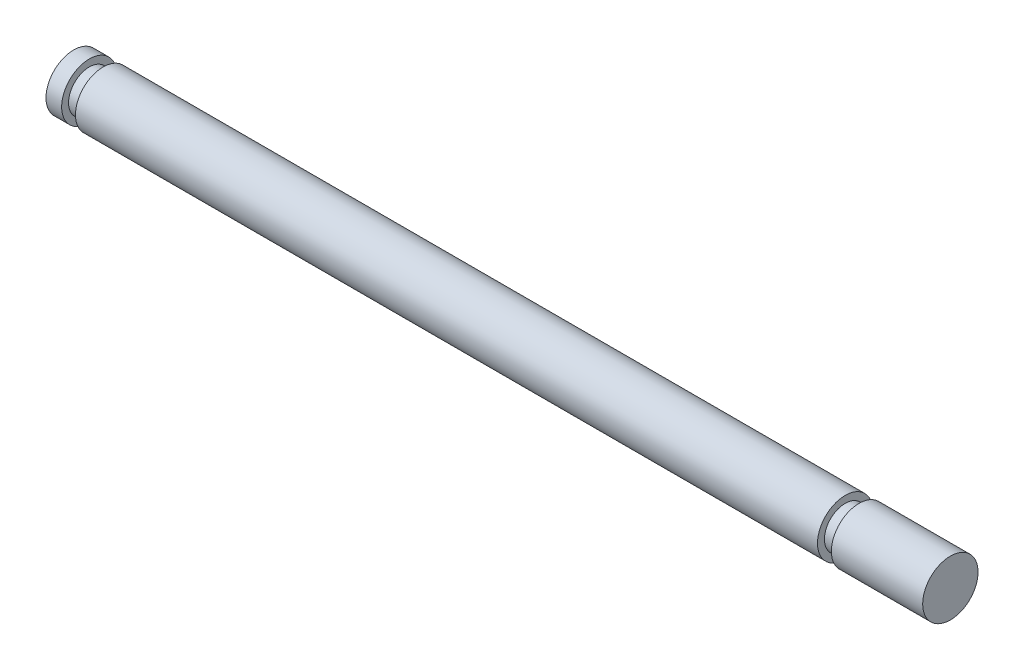
ISO-10303-21;
HEADER;
FILE_DESCRIPTION(('STEP AP214'),'2;1');
FILE_NAME('part.step','',(''),(''),'','','');
FILE_SCHEMA(('AUTOMOTIVE_DESIGN { 1 0 10303 214 1 1 1 1 }'));
ENDSEC;
DATA;
#1=APPLICATION_CONTEXT('core data for automotive mechanical design processes');
#2=APPLICATION_PROTOCOL_DEFINITION('international standard','automotive_design',2000,#1);
#3=PRODUCT_CONTEXT('',#1,'mechanical');
#4=PRODUCT('Part','Part','',(#3));
#5=PRODUCT_RELATED_PRODUCT_CATEGORY('part','',(#4));
#6=PRODUCT_DEFINITION_FORMATION('','',#4);
#7=PRODUCT_DEFINITION_CONTEXT('part definition',#1,'design');
#8=PRODUCT_DEFINITION('design','',#6,#7);
#9=PRODUCT_DEFINITION_SHAPE('','',#8);
#10=(LENGTH_UNIT() NAMED_UNIT(*) SI_UNIT(.MILLI.,.METRE.));
#11=(NAMED_UNIT(*) PLANE_ANGLE_UNIT() SI_UNIT($,.RADIAN.));
#12=(NAMED_UNIT(*) SI_UNIT($,.STERADIAN.) SOLID_ANGLE_UNIT());
#13=UNCERTAINTY_MEASURE_WITH_UNIT(LENGTH_MEASURE(1.E-05),#10,'distance_accuracy_value','');
#14=(GEOMETRIC_REPRESENTATION_CONTEXT(3) GLOBAL_UNCERTAINTY_ASSIGNED_CONTEXT((#13)) GLOBAL_UNIT_ASSIGNED_CONTEXT((#10,
#11,#12)) REPRESENTATION_CONTEXT('',''));
#15=CARTESIAN_POINT('',(0.,0.,0.));
#16=DIRECTION('',(0.,0.,1.));
#17=DIRECTION('',(1.,0.,0.));
#18=AXIS2_PLACEMENT_3D('',#15,#16,#17);
#19=CARTESIAN_POINT('',(1583.,0.,0.));
#20=DIRECTION('',(-1.,0.,0.));
#21=DIRECTION('',(0.,0.,1.));
#22=AXIS2_PLACEMENT_3D('',#19,#20,#21);
#23=PLANE('',#22);
#24=CARTESIAN_POINT('',(1583.,0.,0.));
#25=DIRECTION('',(-1.,0.,0.));
#26=DIRECTION('',(0.,0.,1.));
#27=AXIS2_PLACEMENT_3D('',#24,#25,#26);
#28=CIRCLE('',#27,50.);
#29=CARTESIAN_POINT('',(1583.,0.,50.));
#30=VERTEX_POINT('',#29);
#31=EDGE_CURVE('E10',#30,#30,#28,.T.);
#32=ORIENTED_EDGE('',*,*,#31,.F.);
#33=EDGE_LOOP('',(#32));
#34=FACE_BOUND('',#33,.T.);
#35=ADVANCED_FACE('F31',(#34),#23,.F.);
#36=CARTESIAN_POINT('',(0.,0.,0.));
#37=DIRECTION('',(-1.,0.,0.));
#38=DIRECTION('',(0.,0.,1.));
#39=AXIS2_PLACEMENT_3D('',#36,#37,#38);
#40=CYLINDRICAL_SURFACE('',#39,50.);
#41=CARTESIAN_POINT('',(1418.1,0.,0.));
#42=DIRECTION('',(-1.,0.,0.));
#43=DIRECTION('',(0.,0.,1.));
#44=AXIS2_PLACEMENT_3D('',#41,#42,#43);
#45=CIRCLE('',#44,50.);
#46=CARTESIAN_POINT('',(1418.1,0.,50.));
#47=VERTEX_POINT('',#46);
#48=EDGE_CURVE('E37',#47,#47,#45,.T.);
#49=ORIENTED_EDGE('',*,*,#48,.F.);
#50=EDGE_LOOP('',(#49));
#51=FACE_BOUND('',#50,.T.);
#52=ORIENTED_EDGE('',*,*,#31,.T.);
#53=EDGE_LOOP('',(#52));
#54=FACE_BOUND('',#53,.T.);
#55=ADVANCED_FACE('F115',(#51,#54),#40,.T.);
#56=CARTESIAN_POINT('',(1418.1,50.,0.));
#57=DIRECTION('',(1.,0.,0.));
#58=DIRECTION('',(0.,0.,-1.));
#59=AXIS2_PLACEMENT_3D('',#56,#57,#58);
#60=PLANE('',#59);
#61=CARTESIAN_POINT('',(1418.1,0.,0.));
#62=DIRECTION('',(-1.,0.,0.));
#63=DIRECTION('',(0.,0.,1.));
#64=AXIS2_PLACEMENT_3D('',#61,#62,#63);
#65=CIRCLE('',#64,37.5);
#66=CARTESIAN_POINT('',(1418.1,0.,37.5));
#67=VERTEX_POINT('',#66);
#68=EDGE_CURVE('E41',#67,#67,#65,.T.);
#69=ORIENTED_EDGE('',*,*,#68,.F.);
#70=EDGE_LOOP('',(#69));
#71=FACE_BOUND('',#70,.T.);
#72=ORIENTED_EDGE('',*,*,#48,.T.);
#73=EDGE_LOOP('',(#72));
#74=FACE_BOUND('',#73,.T.);
#75=ADVANCED_FACE('F110',(#71,#74),#60,.F.);
#76=CARTESIAN_POINT('',(0.,0.,0.));
#77=DIRECTION('',(-1.,0.,0.));
#78=DIRECTION('',(0.,0.,1.));
#79=AXIS2_PLACEMENT_3D('',#76,#77,#78);
#80=CYLINDRICAL_SURFACE('',#79,37.5);
#81=CARTESIAN_POINT('',(1393.1,0.,0.));
#82=DIRECTION('',(-1.,0.,0.));
#83=DIRECTION('',(0.,0.,1.));
#84=AXIS2_PLACEMENT_3D('',#81,#82,#83);
#85=CIRCLE('',#84,37.5);
#86=CARTESIAN_POINT('',(1393.1,0.,37.5));
#87=VERTEX_POINT('',#86);
#88=EDGE_CURVE('E45',#87,#87,#85,.T.);
#89=ORIENTED_EDGE('',*,*,#88,.F.);
#90=EDGE_LOOP('',(#89));
#91=FACE_BOUND('',#90,.T.);
#92=ORIENTED_EDGE('',*,*,#68,.T.);
#93=EDGE_LOOP('',(#92));
#94=FACE_BOUND('',#93,.T.);
#95=ADVANCED_FACE('F104',(#91,#94),#80,.T.);
#96=CARTESIAN_POINT('',(1393.1,37.5,0.));
#97=DIRECTION('',(-1.,0.,0.));
#98=DIRECTION('',(0.,0.,1.));
#99=AXIS2_PLACEMENT_3D('',#96,#97,#98);
#100=PLANE('',#99);
#101=CARTESIAN_POINT('',(1393.1,0.,0.));
#102=DIRECTION('',(-1.,0.,0.));
#103=DIRECTION('',(0.,0.,1.));
#104=AXIS2_PLACEMENT_3D('',#101,#102,#103);
#105=CIRCLE('',#104,50.);
#106=CARTESIAN_POINT('',(1393.1,0.,50.));
#107=VERTEX_POINT('',#106);
#108=EDGE_CURVE('E50',#107,#107,#105,.T.);
#109=ORIENTED_EDGE('',*,*,#108,.F.);
#110=EDGE_LOOP('',(#109));
#111=FACE_BOUND('',#110,.T.);
#112=ORIENTED_EDGE('',*,*,#88,.T.);
#113=EDGE_LOOP('',(#112));
#114=FACE_BOUND('',#113,.T.);
#115=ADVANCED_FACE('F98',(#111,#114),#100,.F.);
#116=CARTESIAN_POINT('',(0.,0.,0.));
#117=DIRECTION('',(-1.,0.,0.));
#118=DIRECTION('',(0.,0.,1.));
#119=AXIS2_PLACEMENT_3D('',#116,#117,#118);
#120=CYLINDRICAL_SURFACE('',#119,50.);
#121=CARTESIAN_POINT('',(53.2,0.,0.));
#122=DIRECTION('',(-1.,0.,0.));
#123=DIRECTION('',(0.,0.,1.));
#124=AXIS2_PLACEMENT_3D('',#121,#122,#123);
#125=CIRCLE('',#124,50.);
#126=CARTESIAN_POINT('',(53.2,0.,50.));
#127=VERTEX_POINT('',#126);
#128=EDGE_CURVE('E53',#127,#127,#125,.T.);
#129=ORIENTED_EDGE('',*,*,#128,.F.);
#130=EDGE_LOOP('',(#129));
#131=FACE_BOUND('',#130,.T.);
#132=ORIENTED_EDGE('',*,*,#108,.T.);
#133=EDGE_LOOP('',(#132));
#134=FACE_BOUND('',#133,.T.);
#135=ADVANCED_FACE('F92',(#131,#134),#120,.T.);
#136=CARTESIAN_POINT('',(53.2,37.5,0.));
#137=DIRECTION('',(1.,0.,0.));
#138=DIRECTION('',(0.,0.,-1.));
#139=AXIS2_PLACEMENT_3D('',#136,#137,#138);
#140=PLANE('',#139);
#141=CARTESIAN_POINT('',(53.2,0.,0.));
#142=DIRECTION('',(-1.,0.,0.));
#143=DIRECTION('',(0.,0.,1.));
#144=AXIS2_PLACEMENT_3D('',#141,#142,#143);
#145=CIRCLE('',#144,37.5);
#146=CARTESIAN_POINT('',(53.2,0.,37.5));
#147=VERTEX_POINT('',#146);
#148=EDGE_CURVE('E56',#147,#147,#145,.T.);
#149=ORIENTED_EDGE('',*,*,#148,.F.);
#150=EDGE_LOOP('',(#149));
#151=FACE_BOUND('',#150,.T.);
#152=ORIENTED_EDGE('',*,*,#128,.T.);
#153=EDGE_LOOP('',(#152));
#154=FACE_BOUND('',#153,.T.);
#155=ADVANCED_FACE('F86',(#151,#154),#140,.F.);
#156=CARTESIAN_POINT('',(0.,0.,0.));
#157=DIRECTION('',(-1.,0.,0.));
#158=DIRECTION('',(0.,0.,1.));
#159=AXIS2_PLACEMENT_3D('',#156,#157,#158);
#160=CYLINDRICAL_SURFACE('',#159,37.5);
#161=CARTESIAN_POINT('',(28.2,0.,0.));
#162=DIRECTION('',(-1.,0.,0.));
#163=DIRECTION('',(0.,0.,1.));
#164=AXIS2_PLACEMENT_3D('',#161,#162,#163);
#165=CIRCLE('',#164,37.5);
#166=CARTESIAN_POINT('',(28.2,0.,37.5));
#167=VERTEX_POINT('',#166);
#168=EDGE_CURVE('E59',#167,#167,#165,.T.);
#169=ORIENTED_EDGE('',*,*,#168,.F.);
#170=EDGE_LOOP('',(#169));
#171=FACE_BOUND('',#170,.T.);
#172=ORIENTED_EDGE('',*,*,#148,.T.);
#173=EDGE_LOOP('',(#172));
#174=FACE_BOUND('',#173,.T.);
#175=ADVANCED_FACE('F80',(#171,#174),#160,.T.);
#176=CARTESIAN_POINT('',(28.2,50.,0.));
#177=DIRECTION('',(-1.,0.,0.));
#178=DIRECTION('',(0.,0.,1.));
#179=AXIS2_PLACEMENT_3D('',#176,#177,#178);
#180=PLANE('',#179);
#181=CARTESIAN_POINT('',(28.2,0.,0.));
#182=DIRECTION('',(-1.,0.,0.));
#183=DIRECTION('',(0.,0.,1.));
#184=AXIS2_PLACEMENT_3D('',#181,#182,#183);
#185=CIRCLE('',#184,50.);
#186=CARTESIAN_POINT('',(28.2,0.,50.));
#187=VERTEX_POINT('',#186);
#188=EDGE_CURVE('E62',#187,#187,#185,.T.);
#189=ORIENTED_EDGE('',*,*,#188,.F.);
#190=EDGE_LOOP('',(#189));
#191=FACE_BOUND('',#190,.T.);
#192=ORIENTED_EDGE('',*,*,#168,.T.);
#193=EDGE_LOOP('',(#192));
#194=FACE_BOUND('',#193,.T.);
#195=ADVANCED_FACE('F74',(#191,#194),#180,.F.);
#196=CARTESIAN_POINT('',(0.,0.,0.));
#197=DIRECTION('',(-1.,0.,0.));
#198=DIRECTION('',(0.,0.,1.));
#199=AXIS2_PLACEMENT_3D('',#196,#197,#198);
#200=CYLINDRICAL_SURFACE('',#199,50.);
#201=CARTESIAN_POINT('',(0.,0.,0.));
#202=DIRECTION('',(-1.,0.,0.));
#203=DIRECTION('',(0.,0.,1.));
#204=AXIS2_PLACEMENT_3D('',#201,#202,#203);
#205=CIRCLE('',#204,50.);
#206=CARTESIAN_POINT('',(0.,0.,50.));
#207=VERTEX_POINT('',#206);
#208=EDGE_CURVE('E65',#207,#207,#205,.T.);
#209=ORIENTED_EDGE('',*,*,#208,.F.);
#210=EDGE_LOOP('',(#209));
#211=FACE_BOUND('',#210,.T.);
#212=ORIENTED_EDGE('',*,*,#188,.T.);
#213=EDGE_LOOP('',(#212));
#214=FACE_BOUND('',#213,.T.);
#215=ADVANCED_FACE('F71',(#211,#214),#200,.T.);
#216=CARTESIAN_POINT('',(0.,0.,0.));
#217=DIRECTION('',(1.,0.,0.));
#218=DIRECTION('',(0.,0.,-1.));
#219=AXIS2_PLACEMENT_3D('',#216,#217,#218);
#220=PLANE('',#219);
#221=ORIENTED_EDGE('',*,*,#208,.T.);
#222=EDGE_LOOP('',(#221));
#223=FACE_BOUND('',#222,.T.);
#224=ADVANCED_FACE('F69',(#223),#220,.F.);
#225=CLOSED_SHELL('',(#35,#55,#75,#95,#115,#135,#155,#175,#195,#215,#224));
#226=MANIFOLD_SOLID_BREP('B2',#225);
#227=ADVANCED_BREP_SHAPE_REPRESENTATION('',(#18,#226),#14);
#228=SHAPE_DEFINITION_REPRESENTATION(#9,#227);
ENDSEC;
END-ISO-10303-21;
